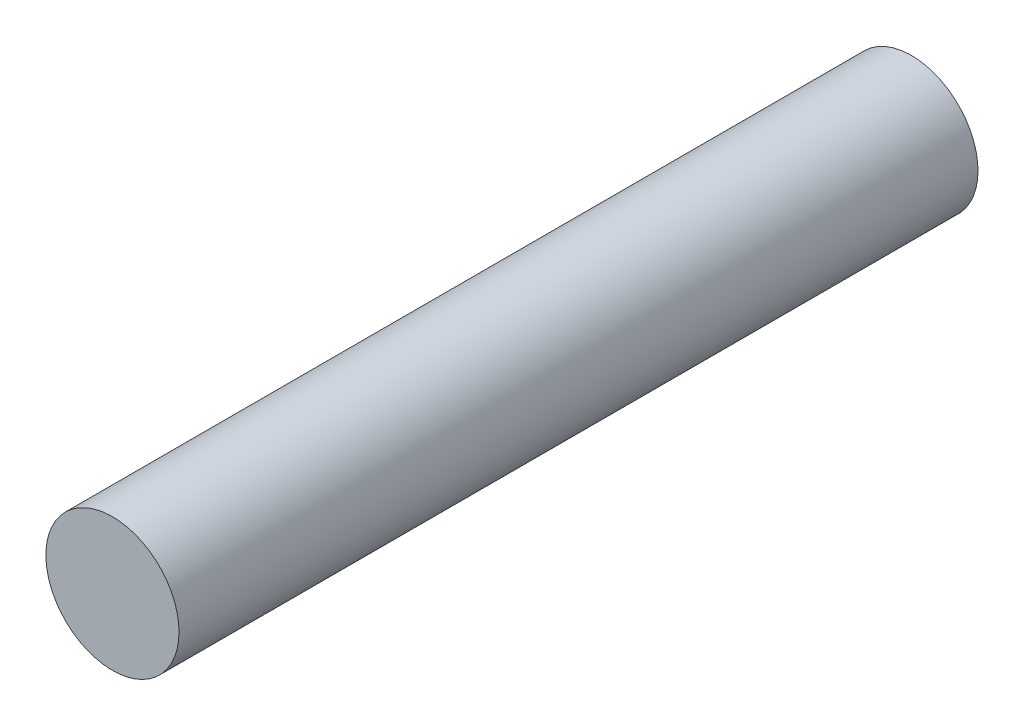
ISO-10303-21;
HEADER;
FILE_DESCRIPTION(('STEP AP214'),'2;1');
FILE_NAME('part.step','',(''),(''),'','','');
FILE_SCHEMA(('AUTOMOTIVE_DESIGN { 1 0 10303 214 1 1 1 1 }'));
ENDSEC;
DATA;
#1=APPLICATION_CONTEXT('core data for automotive mechanical design processes');
#2=APPLICATION_PROTOCOL_DEFINITION('international standard','automotive_design',2000,#1);
#3=PRODUCT_CONTEXT('',#1,'mechanical');
#4=PRODUCT('Part','Part','',(#3));
#5=PRODUCT_RELATED_PRODUCT_CATEGORY('part','',(#4));
#6=PRODUCT_DEFINITION_FORMATION('','',#4);
#7=PRODUCT_DEFINITION_CONTEXT('part definition',#1,'design');
#8=PRODUCT_DEFINITION('design','',#6,#7);
#9=PRODUCT_DEFINITION_SHAPE('','',#8);
#10=(LENGTH_UNIT() NAMED_UNIT(*) SI_UNIT(.MILLI.,.METRE.));
#11=(NAMED_UNIT(*) PLANE_ANGLE_UNIT() SI_UNIT($,.RADIAN.));
#12=(NAMED_UNIT(*) SI_UNIT($,.STERADIAN.) SOLID_ANGLE_UNIT());
#13=UNCERTAINTY_MEASURE_WITH_UNIT(LENGTH_MEASURE(1.E-05),#10,'distance_accuracy_value','');
#14=(GEOMETRIC_REPRESENTATION_CONTEXT(3) GLOBAL_UNCERTAINTY_ASSIGNED_CONTEXT((#13)) GLOBAL_UNIT_ASSIGNED_CONTEXT((#10,
#11,#12)) REPRESENTATION_CONTEXT('',''));
#15=CARTESIAN_POINT('',(0.,0.,0.));
#16=DIRECTION('',(0.,0.,1.));
#17=DIRECTION('',(1.,0.,0.));
#18=AXIS2_PLACEMENT_3D('',#15,#16,#17);
#19=CARTESIAN_POINT('',(0.,0.,24.));
#20=DIRECTION('',(0.,0.,-1.));
#21=DIRECTION('',(-1.,0.,0.));
#22=AXIS2_PLACEMENT_3D('',#19,#20,#21);
#23=CYLINDRICAL_SURFACE('',#22,2.);
#24=CARTESIAN_POINT('',(0.,0.,24.));
#25=DIRECTION('',(0.,0.,1.));
#26=DIRECTION('',(1.,0.,0.));
#27=AXIS2_PLACEMENT_3D('',#24,#25,#26);
#28=CIRCLE('',#27,2.);
#29=CARTESIAN_POINT('',(2.,0.,24.));
#30=VERTEX_POINT('',#29);
#31=EDGE_CURVE('E10',#30,#30,#28,.T.);
#32=ORIENTED_EDGE('',*,*,#31,.F.);
#33=EDGE_LOOP('',(#32));
#34=FACE_BOUND('',#33,.T.);
#35=CARTESIAN_POINT('',(0.,0.,0.));
#36=DIRECTION('',(0.,0.,1.));
#37=DIRECTION('',(1.,0.,0.));
#38=AXIS2_PLACEMENT_3D('',#35,#36,#37);
#39=CIRCLE('',#38,2.);
#40=CARTESIAN_POINT('',(2.,0.,0.));
#41=VERTEX_POINT('',#40);
#42=EDGE_CURVE('E34',#41,#41,#39,.T.);
#43=ORIENTED_EDGE('',*,*,#42,.T.);
#44=EDGE_LOOP('',(#43));
#45=FACE_BOUND('',#44,.T.);
#46=ADVANCED_FACE('F31',(#34,#45),#23,.T.);
#47=CARTESIAN_POINT('',(0.,0.,24.));
#48=DIRECTION('',(0.,0.,1.));
#49=DIRECTION('',(1.,0.,0.));
#50=AXIS2_PLACEMENT_3D('',#47,#48,#49);
#51=PLANE('',#50);
#52=ORIENTED_EDGE('',*,*,#31,.T.);
#53=EDGE_LOOP('',(#52));
#54=FACE_BOUND('',#53,.T.);
#55=ADVANCED_FACE('F46',(#54),#51,.T.);
#56=CARTESIAN_POINT('',(0.,0.,0.));
#57=DIRECTION('',(0.,0.,1.));
#58=DIRECTION('',(1.,0.,0.));
#59=AXIS2_PLACEMENT_3D('',#56,#57,#58);
#60=PLANE('',#59);
#61=ORIENTED_EDGE('',*,*,#42,.F.);
#62=EDGE_LOOP('',(#61));
#63=FACE_BOUND('',#62,.T.);
#64=ADVANCED_FACE('F44',(#63),#60,.F.);
#65=CLOSED_SHELL('',(#46,#55,#64));
#66=MANIFOLD_SOLID_BREP('B2',#65);
#67=ADVANCED_BREP_SHAPE_REPRESENTATION('',(#18,#66),#14);
#68=SHAPE_DEFINITION_REPRESENTATION(#9,#67);
ENDSEC;
END-ISO-10303-21;
